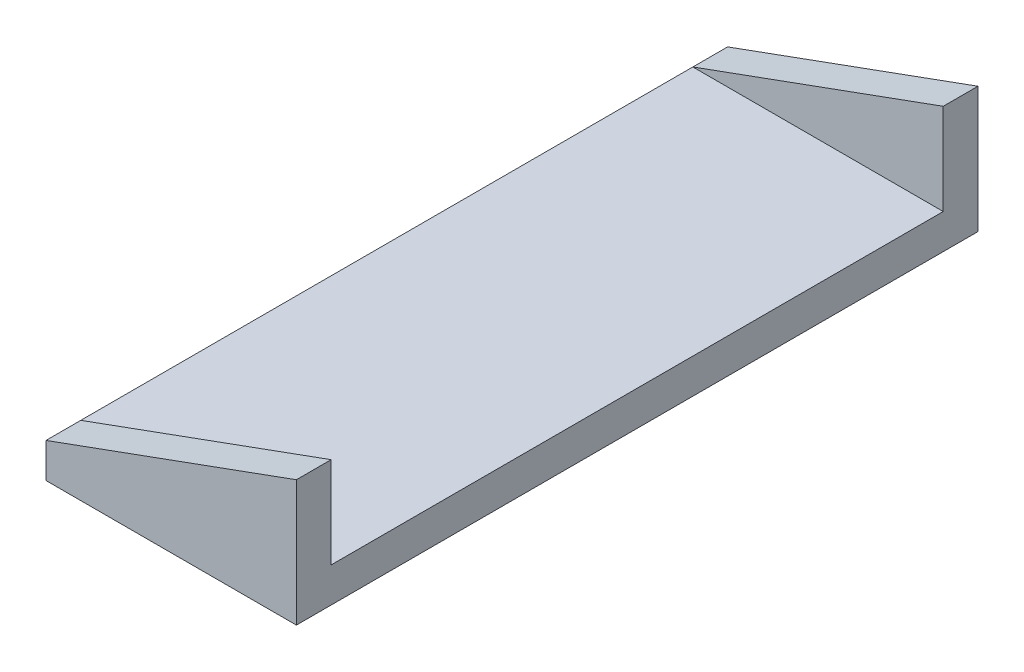
ISO-10303-21;
HEADER;
FILE_DESCRIPTION(('STEP AP214'),'2;1');
FILE_NAME('part.step','',(''),(''),'','','');
FILE_SCHEMA(('AUTOMOTIVE_DESIGN { 1 0 10303 214 1 1 1 1 }'));
ENDSEC;
DATA;
#1=APPLICATION_CONTEXT('core data for automotive mechanical design processes');
#2=APPLICATION_PROTOCOL_DEFINITION('international standard','automotive_design',2000,#1);
#3=PRODUCT_CONTEXT('',#1,'mechanical');
#4=PRODUCT('Part','Part','',(#3));
#5=PRODUCT_RELATED_PRODUCT_CATEGORY('part','',(#4));
#6=PRODUCT_DEFINITION_FORMATION('','',#4);
#7=PRODUCT_DEFINITION_CONTEXT('part definition',#1,'design');
#8=PRODUCT_DEFINITION('design','',#6,#7);
#9=PRODUCT_DEFINITION_SHAPE('','',#8);
#10=(LENGTH_UNIT() NAMED_UNIT(*) SI_UNIT(.MILLI.,.METRE.));
#11=(NAMED_UNIT(*) PLANE_ANGLE_UNIT() SI_UNIT($,.RADIAN.));
#12=(NAMED_UNIT(*) SI_UNIT($,.STERADIAN.) SOLID_ANGLE_UNIT());
#13=UNCERTAINTY_MEASURE_WITH_UNIT(LENGTH_MEASURE(1.E-05),#10,'distance_accuracy_value','');
#14=(GEOMETRIC_REPRESENTATION_CONTEXT(3) GLOBAL_UNCERTAINTY_ASSIGNED_CONTEXT((#13)) GLOBAL_UNIT_ASSIGNED_CONTEXT((#10,
#11,#12)) REPRESENTATION_CONTEXT('',''));
#15=CARTESIAN_POINT('',(0.,0.,0.));
#16=DIRECTION('',(0.,0.,1.));
#17=DIRECTION('',(1.,0.,0.));
#18=AXIS2_PLACEMENT_3D('',#15,#16,#17);
#19=CARTESIAN_POINT('',(0.,63.5,0.));
#20=DIRECTION('',(1.,0.,0.));
#21=DIRECTION('',(0.,0.,-1.));
#22=AXIS2_PLACEMENT_3D('',#19,#20,#21);
#23=PLANE('',#22);
#24=DIRECTION('',(0.,0.,-1.));
#25=VECTOR('',#24,1.);
#26=CARTESIAN_POINT('',(0.,63.5,36.5759999999998));
#27=LINE('',#26,#25);
#28=CARTESIAN_POINT('',(0.,63.5,0.));
#29=VERTEX_POINT('',#28);
#30=CARTESIAN_POINT('',(0.,63.5,-63.5000000000001));
#31=VERTEX_POINT('',#30);
#32=EDGE_CURVE('E90',#29,#31,#27,.T.);
#33=ORIENTED_EDGE('',*,*,#32,.T.);
#34=DIRECTION('',(0.,0.,1.));
#35=VECTOR('',#34,1.);
#36=CARTESIAN_POINT('',(0.,63.5,0.));
#37=LINE('',#36,#35);
#38=CARTESIAN_POINT('',(0.,63.5,-1181.1));
#39=VERTEX_POINT('',#38);
#40=EDGE_CURVE('E100',#39,#31,#37,.T.);
#41=ORIENTED_EDGE('',*,*,#40,.F.);
#42=DIRECTION('',(0.,0.,1.));
#43=VECTOR('',#42,1.);
#44=CARTESIAN_POINT('',(0.,63.5,-1281.176));
#45=LINE('',#44,#43);
#46=CARTESIAN_POINT('',(0.,63.5,-1244.6));
#47=VERTEX_POINT('',#46);
#48=EDGE_CURVE('E55',#47,#39,#45,.T.);
#49=ORIENTED_EDGE('',*,*,#48,.F.);
#50=DIRECTION('',(0.,-1.,0.));
#51=VECTOR('',#50,1.);
#52=CARTESIAN_POINT('',(0.,63.5,-1244.6));
#53=LINE('',#52,#51);
#54=CARTESIAN_POINT('',(0.,0.,-1244.6));
#55=VERTEX_POINT('',#54);
#56=EDGE_CURVE('E129',#47,#55,#53,.T.);
#57=ORIENTED_EDGE('',*,*,#56,.T.);
#58=DIRECTION('',(0.,0.,1.));
#59=VECTOR('',#58,1.);
#60=CARTESIAN_POINT('',(0.,0.,0.));
#61=LINE('',#60,#59);
#62=CARTESIAN_POINT('',(0.,0.,0.));
#63=VERTEX_POINT('',#62);
#64=EDGE_CURVE('E126',#55,#63,#61,.T.);
#65=ORIENTED_EDGE('',*,*,#64,.T.);
#66=DIRECTION('',(0.,-1.,0.));
#67=VECTOR('',#66,1.);
#68=CARTESIAN_POINT('',(0.,63.5,0.));
#69=LINE('',#68,#67);
#70=EDGE_CURVE('E11',#29,#63,#69,.T.);
#71=ORIENTED_EDGE('',*,*,#70,.F.);
#72=EDGE_LOOP('',(#33,#41,#49,#57,#65,#71));
#73=FACE_BOUND('',#72,.T.);
#74=ADVANCED_FACE('F33',(#73),#23,.F.);
#75=CARTESIAN_POINT('',(0.,63.5,0.));
#76=DIRECTION('',(0.,0.,-1.));
#77=DIRECTION('',(-1.,0.,0.));
#78=AXIS2_PLACEMENT_3D('',#75,#76,#77);
#79=PLANE('',#78);
#80=DIRECTION('',(0.939692620785908,0.34202014332567,0.));
#81=VECTOR('',#80,1.);
#82=CARTESIAN_POINT('',(0.,63.5,0.));
#83=LINE('',#82,#81);
#84=CARTESIAN_POINT('',(457.2,229.907191106508,0.));
#85=VERTEX_POINT('',#84);
#86=EDGE_CURVE('E162',#29,#85,#83,.T.);
#87=ORIENTED_EDGE('',*,*,#86,.F.);
#88=ORIENTED_EDGE('',*,*,#70,.T.);
#89=DIRECTION('',(1.,0.,0.));
#90=VECTOR('',#89,1.);
#91=CARTESIAN_POINT('',(0.,0.,0.));
#92=LINE('',#91,#90);
#93=CARTESIAN_POINT('',(457.2,0.,0.));
#94=VERTEX_POINT('',#93);
#95=EDGE_CURVE('E131',#63,#94,#92,.T.);
#96=ORIENTED_EDGE('',*,*,#95,.T.);
#97=DIRECTION('',(0.,-1.,0.));
#98=VECTOR('',#97,1.);
#99=CARTESIAN_POINT('',(457.2,63.5,0.));
#100=LINE('',#99,#98);
#101=EDGE_CURVE('E40',#85,#94,#100,.T.);
#102=ORIENTED_EDGE('',*,*,#101,.F.);
#103=EDGE_LOOP('',(#87,#88,#96,#102));
#104=FACE_BOUND('',#103,.T.);
#105=ADVANCED_FACE('F149',(#104),#79,.F.);
#106=CARTESIAN_POINT('',(457.2,63.5,0.));
#107=DIRECTION('',(-1.,0.,0.));
#108=DIRECTION('',(0.,0.,1.));
#109=AXIS2_PLACEMENT_3D('',#106,#107,#108);
#110=PLANE('',#109);
#111=DIRECTION('',(0.,0.,-1.));
#112=VECTOR('',#111,1.);
#113=CARTESIAN_POINT('',(457.2,229.907191106508,36.5759999999998));
#114=LINE('',#113,#112);
#115=CARTESIAN_POINT('',(457.2,229.907191106508,-63.5000000000001));
#116=VERTEX_POINT('',#115);
#117=EDGE_CURVE('E47',#85,#116,#114,.T.);
#118=ORIENTED_EDGE('',*,*,#117,.F.);
#119=ORIENTED_EDGE('',*,*,#101,.T.);
#120=DIRECTION('',(0.,0.,-1.));
#121=VECTOR('',#120,1.);
#122=CARTESIAN_POINT('',(457.2,0.,0.));
#123=LINE('',#122,#121);
#124=CARTESIAN_POINT('',(457.2,0.,-1244.6));
#125=VERTEX_POINT('',#124);
#126=EDGE_CURVE('E134',#94,#125,#123,.T.);
#127=ORIENTED_EDGE('',*,*,#126,.T.);
#128=DIRECTION('',(0.,-1.,0.));
#129=VECTOR('',#128,1.);
#130=CARTESIAN_POINT('',(457.2,63.5,-1244.6));
#131=LINE('',#130,#129);
#132=CARTESIAN_POINT('',(457.2,229.907191106508,-1244.6));
#133=VERTEX_POINT('',#132);
#134=EDGE_CURVE('E140',#133,#125,#131,.T.);
#135=ORIENTED_EDGE('',*,*,#134,.F.);
#136=DIRECTION('',(0.,0.,1.));
#137=VECTOR('',#136,1.);
#138=CARTESIAN_POINT('',(457.2,229.907191106508,-1281.176));
#139=LINE('',#138,#137);
#140=CARTESIAN_POINT('',(457.2,229.907191106508,-1181.1));
#141=VERTEX_POINT('',#140);
#142=EDGE_CURVE('E157',#133,#141,#139,.T.);
#143=ORIENTED_EDGE('',*,*,#142,.T.);
#144=DIRECTION('',(0.,-1.,0.));
#145=VECTOR('',#144,1.);
#146=CARTESIAN_POINT('',(457.2,330.2,-1181.1));
#147=LINE('',#146,#145);
#148=CARTESIAN_POINT('',(457.2,63.5,-1181.1));
#149=VERTEX_POINT('',#148);
#150=EDGE_CURVE('E125',#141,#149,#147,.T.);
#151=ORIENTED_EDGE('',*,*,#150,.T.);
#152=DIRECTION('',(0.,0.,-1.));
#153=VECTOR('',#152,1.);
#154=CARTESIAN_POINT('',(457.2,63.5,0.));
#155=LINE('',#154,#153);
#156=CARTESIAN_POINT('',(457.2,63.5,-63.5000000000001));
#157=VERTEX_POINT('',#156);
#158=EDGE_CURVE('E111',#157,#149,#155,.T.);
#159=ORIENTED_EDGE('',*,*,#158,.F.);
#160=DIRECTION('',(0.,-1.,0.));
#161=VECTOR('',#160,1.);
#162=CARTESIAN_POINT('',(457.2,330.2,-63.5000000000001));
#163=LINE('',#162,#161);
#164=EDGE_CURVE('E115',#116,#157,#163,.T.);
#165=ORIENTED_EDGE('',*,*,#164,.F.);
#166=EDGE_LOOP('',(#118,#119,#127,#135,#143,#151,#159,#165));
#167=FACE_BOUND('',#166,.T.);
#168=ADVANCED_FACE('F143',(#167),#110,.F.);
#169=CARTESIAN_POINT('',(457.2,330.2,-63.5000000000001));
#170=DIRECTION('',(0.,0.,1.));
#171=DIRECTION('',(1.,0.,0.));
#172=AXIS2_PLACEMENT_3D('',#169,#170,#171);
#173=PLANE('',#172);
#174=DIRECTION('',(0.939692620785908,0.34202014332567,0.));
#175=VECTOR('',#174,1.);
#176=CARTESIAN_POINT('',(457.2,229.907191106508,-63.5000000000001));
#177=LINE('',#176,#175);
#178=EDGE_CURVE('E87',#31,#116,#177,.T.);
#179=ORIENTED_EDGE('',*,*,#178,.T.);
#180=ORIENTED_EDGE('',*,*,#164,.T.);
#181=DIRECTION('',(-1.,0.,0.));
#182=VECTOR('',#181,1.);
#183=CARTESIAN_POINT('',(457.2,63.5,-63.5000000000001));
#184=LINE('',#183,#182);
#185=EDGE_CURVE('E108',#157,#31,#184,.T.);
#186=ORIENTED_EDGE('',*,*,#185,.T.);
#187=EDGE_LOOP('',(#179,#180,#186));
#188=FACE_BOUND('',#187,.T.);
#189=ADVANCED_FACE('F114',(#188),#173,.F.);
#190=CARTESIAN_POINT('',(0.,63.5,0.));
#191=DIRECTION('',(0.,-1.,0.));
#192=DIRECTION('',(0.,0.,-1.));
#193=AXIS2_PLACEMENT_3D('',#190,#191,#192);
#194=PLANE('',#193);
#195=ORIENTED_EDGE('',*,*,#185,.F.);
#196=ORIENTED_EDGE('',*,*,#158,.T.);
#197=DIRECTION('',(-1.,0.,0.));
#198=VECTOR('',#197,1.);
#199=CARTESIAN_POINT('',(457.2,63.5,-1181.1));
#200=LINE('',#199,#198);
#201=EDGE_CURVE('E110',#149,#39,#200,.T.);
#202=ORIENTED_EDGE('',*,*,#201,.T.);
#203=ORIENTED_EDGE('',*,*,#40,.T.);
#204=EDGE_LOOP('',(#195,#196,#202,#203));
#205=FACE_BOUND('',#204,.T.);
#206=ADVANCED_FACE('F106',(#205),#194,.F.);
#207=CARTESIAN_POINT('',(0.,63.5,-1244.6));
#208=DIRECTION('',(0.,0.,1.));
#209=DIRECTION('',(1.,0.,0.));
#210=AXIS2_PLACEMENT_3D('',#207,#208,#209);
#211=PLANE('',#210);
#212=ORIENTED_EDGE('',*,*,#56,.F.);
#213=DIRECTION('',(0.939692620785908,0.34202014332567,0.));
#214=VECTOR('',#213,1.);
#215=CARTESIAN_POINT('',(0.,63.5,-1244.6));
#216=LINE('',#215,#214);
#217=EDGE_CURVE('E117',#47,#133,#216,.T.);
#218=ORIENTED_EDGE('',*,*,#217,.T.);
#219=ORIENTED_EDGE('',*,*,#134,.T.);
#220=DIRECTION('',(-1.,0.,0.));
#221=VECTOR('',#220,1.);
#222=CARTESIAN_POINT('',(0.,0.,-1244.6));
#223=LINE('',#222,#221);
#224=EDGE_CURVE('E112',#125,#55,#223,.T.);
#225=ORIENTED_EDGE('',*,*,#224,.T.);
#226=EDGE_LOOP('',(#212,#218,#219,#225));
#227=FACE_BOUND('',#226,.T.);
#228=ADVANCED_FACE('F155',(#227),#211,.F.);
#229=CARTESIAN_POINT('',(0.,0.,0.));
#230=DIRECTION('',(0.,-1.,0.));
#231=DIRECTION('',(0.,0.,-1.));
#232=AXIS2_PLACEMENT_3D('',#229,#230,#231);
#233=PLANE('',#232);
#234=ORIENTED_EDGE('',*,*,#64,.F.);
#235=ORIENTED_EDGE('',*,*,#224,.F.);
#236=ORIENTED_EDGE('',*,*,#126,.F.);
#237=ORIENTED_EDGE('',*,*,#95,.F.);
#238=EDGE_LOOP('',(#234,#235,#236,#237));
#239=FACE_BOUND('',#238,.T.);
#240=ADVANCED_FACE('F152',(#239),#233,.T.);
#241=CARTESIAN_POINT('',(457.2,330.2,-1181.1));
#242=DIRECTION('',(0.,0.,1.));
#243=DIRECTION('',(1.,0.,0.));
#244=AXIS2_PLACEMENT_3D('',#241,#242,#243);
#245=PLANE('',#244);
#246=DIRECTION('',(0.939692620785908,0.34202014332567,0.));
#247=VECTOR('',#246,1.);
#248=CARTESIAN_POINT('',(457.2,229.907191106508,-1181.1));
#249=LINE('',#248,#247);
#250=EDGE_CURVE('E159',#39,#141,#249,.T.);
#251=ORIENTED_EDGE('',*,*,#250,.F.);
#252=ORIENTED_EDGE('',*,*,#201,.F.);
#253=ORIENTED_EDGE('',*,*,#150,.F.);
#254=EDGE_LOOP('',(#251,#252,#253));
#255=FACE_BOUND('',#254,.T.);
#256=ADVANCED_FACE('F161',(#255),#245,.T.);
#257=CARTESIAN_POINT('',(457.2,229.907191106508,-1281.176));
#258=DIRECTION('',(0.34202014332567,-0.939692620785908,0.));
#259=DIRECTION('',(0.939692620785908,0.34202014332567,0.));
#260=AXIS2_PLACEMENT_3D('',#257,#258,#259);
#261=PLANE('',#260);
#262=ORIENTED_EDGE('',*,*,#48,.T.);
#263=ORIENTED_EDGE('',*,*,#250,.T.);
#264=ORIENTED_EDGE('',*,*,#142,.F.);
#265=ORIENTED_EDGE('',*,*,#217,.F.);
#266=EDGE_LOOP('',(#262,#263,#264,#265));
#267=FACE_BOUND('',#266,.T.);
#268=ADVANCED_FACE('F167',(#267),#261,.F.);
#269=CARTESIAN_POINT('',(457.2,229.907191106508,36.5759999999998));
#270=DIRECTION('',(-0.34202014332567,0.939692620785908,0.));
#271=DIRECTION('',(-0.939692620785908,-0.34202014332567,0.));
#272=AXIS2_PLACEMENT_3D('',#269,#270,#271);
#273=PLANE('',#272);
#274=ORIENTED_EDGE('',*,*,#86,.T.);
#275=ORIENTED_EDGE('',*,*,#117,.T.);
#276=ORIENTED_EDGE('',*,*,#178,.F.);
#277=ORIENTED_EDGE('',*,*,#32,.F.);
#278=EDGE_LOOP('',(#274,#275,#276,#277));
#279=FACE_BOUND('',#278,.T.);
#280=ADVANCED_FACE('F89',(#279),#273,.T.);
#281=CLOSED_SHELL('',(#74,#105,#168,#189,#206,#228,#240,#256,#268,#280));
#282=MANIFOLD_SOLID_BREP('B2',#281);
#283=ADVANCED_BREP_SHAPE_REPRESENTATION('',(#18,#282),#14);
#284=SHAPE_DEFINITION_REPRESENTATION(#9,#283);
ENDSEC;
END-ISO-10303-21;
